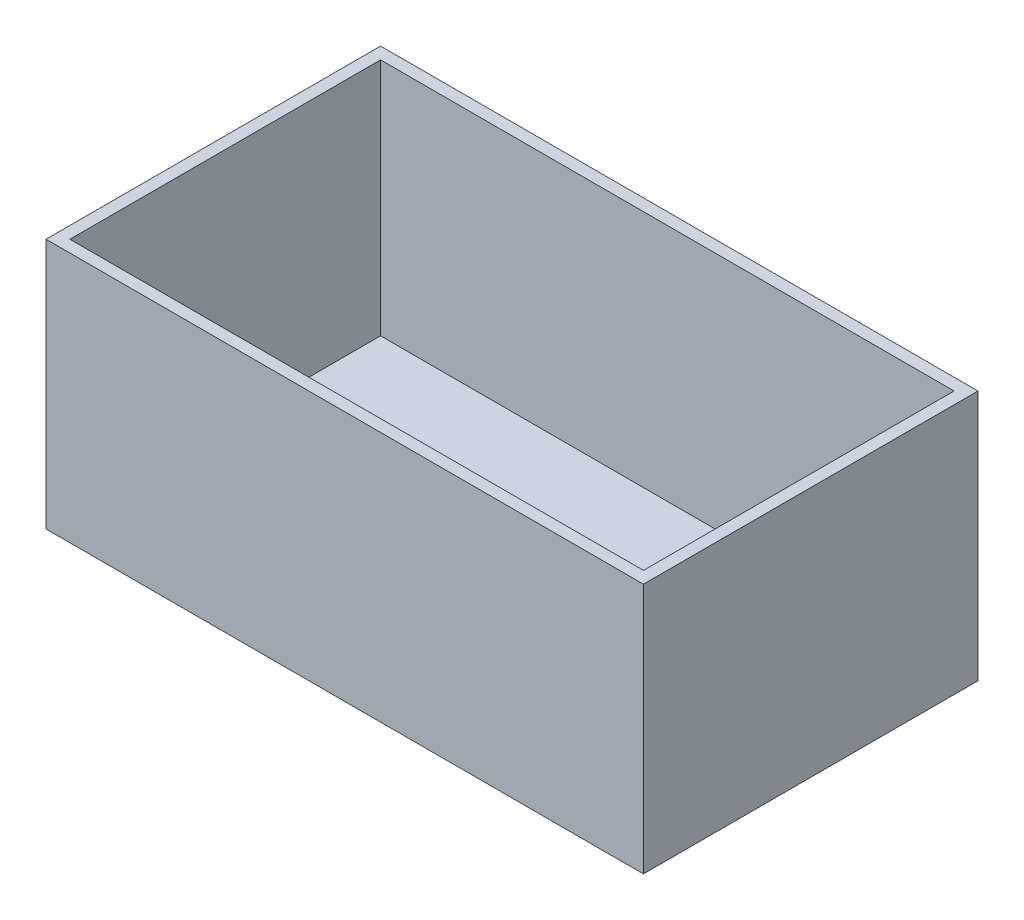
ISO-10303-21;
HEADER;
FILE_DESCRIPTION(('STEP AP214'),'2;1');
FILE_NAME('part.step','',(''),(''),'','','');
FILE_SCHEMA(('AUTOMOTIVE_DESIGN { 1 0 10303 214 1 1 1 1 }'));
ENDSEC;
DATA;
#1=APPLICATION_CONTEXT('core data for automotive mechanical design processes');
#2=APPLICATION_PROTOCOL_DEFINITION('international standard','automotive_design',2000,#1);
#3=PRODUCT_CONTEXT('',#1,'mechanical');
#4=PRODUCT('Part','Part','',(#3));
#5=PRODUCT_RELATED_PRODUCT_CATEGORY('part','',(#4));
#6=PRODUCT_DEFINITION_FORMATION('','',#4);
#7=PRODUCT_DEFINITION_CONTEXT('part definition',#1,'design');
#8=PRODUCT_DEFINITION('design','',#6,#7);
#9=PRODUCT_DEFINITION_SHAPE('','',#8);
#10=(LENGTH_UNIT() NAMED_UNIT(*) SI_UNIT(.MILLI.,.METRE.));
#11=(NAMED_UNIT(*) PLANE_ANGLE_UNIT() SI_UNIT($,.RADIAN.));
#12=(NAMED_UNIT(*) SI_UNIT($,.STERADIAN.) SOLID_ANGLE_UNIT());
#13=UNCERTAINTY_MEASURE_WITH_UNIT(LENGTH_MEASURE(1.E-05),#10,'distance_accuracy_value','');
#14=(GEOMETRIC_REPRESENTATION_CONTEXT(3) GLOBAL_UNCERTAINTY_ASSIGNED_CONTEXT((#13)) GLOBAL_UNIT_ASSIGNED_CONTEXT((#10,
#11,#12)) REPRESENTATION_CONTEXT('',''));
#15=CARTESIAN_POINT('',(0.,0.,0.));
#16=DIRECTION('',(0.,0.,1.));
#17=DIRECTION('',(1.,0.,0.));
#18=AXIS2_PLACEMENT_3D('',#15,#16,#17);
#19=CARTESIAN_POINT('',(-85.3448275862069,-63.,-44.7737068965517));
#20=DIRECTION('',(-1.,0.,0.));
#21=DIRECTION('',(0.,0.,1.));
#22=AXIS2_PLACEMENT_3D('',#19,#20,#21);
#23=PLANE('',#22);
#24=DIRECTION('',(0.,0.,1.));
#25=VECTOR('',#24,1.);
#26=CARTESIAN_POINT('',(-85.3448275862069,0.,-44.7737068965517));
#27=LINE('',#26,#25);
#28=CARTESIAN_POINT('',(-85.3448275862069,0.,-44.7737068965517));
#29=VERTEX_POINT('',#28);
#30=CARTESIAN_POINT('',(-85.3448275862069,0.,39.2262931034483));
#31=VERTEX_POINT('',#30);
#32=EDGE_CURVE('E120',#29,#31,#27,.T.);
#33=ORIENTED_EDGE('',*,*,#32,.F.);
#34=DIRECTION('',(0.,1.,0.));
#35=VECTOR('',#34,1.);
#36=CARTESIAN_POINT('',(-85.3448275862069,-63.,-44.7737068965517));
#37=LINE('',#36,#35);
#38=CARTESIAN_POINT('',(-85.3448275862069,-63.,-44.7737068965517));
#39=VERTEX_POINT('',#38);
#40=EDGE_CURVE('E11',#39,#29,#37,.T.);
#41=ORIENTED_EDGE('',*,*,#40,.F.);
#42=DIRECTION('',(0.,0.,1.));
#43=VECTOR('',#42,1.);
#44=CARTESIAN_POINT('',(-85.3448275862069,-63.,-44.7737068965517));
#45=LINE('',#44,#43);
#46=CARTESIAN_POINT('',(-85.3448275862069,-63.,39.2262931034483));
#47=VERTEX_POINT('',#46);
#48=EDGE_CURVE('E151',#39,#47,#45,.T.);
#49=ORIENTED_EDGE('',*,*,#48,.T.);
#50=DIRECTION('',(0.,1.,0.));
#51=VECTOR('',#50,1.);
#52=CARTESIAN_POINT('',(-85.3448275862069,-63.,39.2262931034483));
#53=LINE('',#52,#51);
#54=EDGE_CURVE('E41',#47,#31,#53,.T.);
#55=ORIENTED_EDGE('',*,*,#54,.T.);
#56=EDGE_LOOP('',(#33,#41,#49,#55));
#57=FACE_BOUND('',#56,.T.);
#58=ADVANCED_FACE('F38',(#57),#23,.T.);
#59=CARTESIAN_POINT('',(-85.3448275862069,-63.,-44.7737068965517));
#60=DIRECTION('',(0.,0.,-1.));
#61=DIRECTION('',(-1.,0.,0.));
#62=AXIS2_PLACEMENT_3D('',#59,#60,#61);
#63=PLANE('',#62);
#64=DIRECTION('',(-1.,0.,0.));
#65=VECTOR('',#64,1.);
#66=CARTESIAN_POINT('',(-85.3448275862069,0.,-44.7737068965517));
#67=LINE('',#66,#65);
#68=CARTESIAN_POINT('',(64.6551724137931,0.,-44.7737068965517));
#69=VERTEX_POINT('',#68);
#70=EDGE_CURVE('E154',#69,#29,#67,.T.);
#71=ORIENTED_EDGE('',*,*,#70,.F.);
#72=DIRECTION('',(0.,1.,0.));
#73=VECTOR('',#72,1.);
#74=CARTESIAN_POINT('',(64.6551724137931,-63.,-44.7737068965517));
#75=LINE('',#74,#73);
#76=CARTESIAN_POINT('',(64.6551724137931,-63.,-44.7737068965517));
#77=VERTEX_POINT('',#76);
#78=EDGE_CURVE('E46',#77,#69,#75,.T.);
#79=ORIENTED_EDGE('',*,*,#78,.F.);
#80=DIRECTION('',(-1.,0.,0.));
#81=VECTOR('',#80,1.);
#82=CARTESIAN_POINT('',(-85.3448275862069,-63.,-44.7737068965517));
#83=LINE('',#82,#81);
#84=EDGE_CURVE('E159',#77,#39,#83,.T.);
#85=ORIENTED_EDGE('',*,*,#84,.T.);
#86=ORIENTED_EDGE('',*,*,#40,.T.);
#87=EDGE_LOOP('',(#71,#79,#85,#86));
#88=FACE_BOUND('',#87,.T.);
#89=ADVANCED_FACE('F176',(#88),#63,.T.);
#90=CARTESIAN_POINT('',(64.6551724137931,-63.,-44.7737068965517));
#91=DIRECTION('',(1.,0.,0.));
#92=DIRECTION('',(0.,0.,-1.));
#93=AXIS2_PLACEMENT_3D('',#90,#91,#92);
#94=PLANE('',#93);
#95=DIRECTION('',(0.,0.,-1.));
#96=VECTOR('',#95,1.);
#97=CARTESIAN_POINT('',(64.6551724137931,0.,-44.7737068965517));
#98=LINE('',#97,#96);
#99=CARTESIAN_POINT('',(64.6551724137931,0.,39.2262931034483));
#100=VERTEX_POINT('',#99);
#101=EDGE_CURVE('E166',#100,#69,#98,.T.);
#102=ORIENTED_EDGE('',*,*,#101,.F.);
#103=DIRECTION('',(0.,1.,0.));
#104=VECTOR('',#103,1.);
#105=CARTESIAN_POINT('',(64.6551724137931,-63.,39.2262931034483));
#106=LINE('',#105,#104);
#107=CARTESIAN_POINT('',(64.6551724137931,-63.,39.2262931034483));
#108=VERTEX_POINT('',#107);
#109=EDGE_CURVE('E171',#108,#100,#106,.T.);
#110=ORIENTED_EDGE('',*,*,#109,.F.);
#111=DIRECTION('',(0.,0.,-1.));
#112=VECTOR('',#111,1.);
#113=CARTESIAN_POINT('',(64.6551724137931,-63.,-44.7737068965517));
#114=LINE('',#113,#112);
#115=EDGE_CURVE('E156',#108,#77,#114,.T.);
#116=ORIENTED_EDGE('',*,*,#115,.T.);
#117=ORIENTED_EDGE('',*,*,#78,.T.);
#118=EDGE_LOOP('',(#102,#110,#116,#117));
#119=FACE_BOUND('',#118,.T.);
#120=ADVANCED_FACE('F180',(#119),#94,.T.);
#121=CARTESIAN_POINT('',(-85.3448275862069,-63.,39.2262931034483));
#122=DIRECTION('',(0.,0.,1.));
#123=DIRECTION('',(1.,0.,0.));
#124=AXIS2_PLACEMENT_3D('',#121,#122,#123);
#125=PLANE('',#124);
#126=DIRECTION('',(1.,0.,0.));
#127=VECTOR('',#126,1.);
#128=CARTESIAN_POINT('',(-85.3448275862069,0.,39.2262931034483));
#129=LINE('',#128,#127);
#130=EDGE_CURVE('E163',#31,#100,#129,.T.);
#131=ORIENTED_EDGE('',*,*,#130,.F.);
#132=ORIENTED_EDGE('',*,*,#54,.F.);
#133=DIRECTION('',(1.,0.,0.));
#134=VECTOR('',#133,1.);
#135=CARTESIAN_POINT('',(-85.3448275862069,-63.,39.2262931034483));
#136=LINE('',#135,#134);
#137=EDGE_CURVE('E153',#47,#108,#136,.T.);
#138=ORIENTED_EDGE('',*,*,#137,.T.);
#139=ORIENTED_EDGE('',*,*,#109,.T.);
#140=EDGE_LOOP('',(#131,#132,#138,#139));
#141=FACE_BOUND('',#140,.T.);
#142=ADVANCED_FACE('F173',(#141),#125,.T.);
#143=CARTESIAN_POINT('',(0.,-63.,0.));
#144=DIRECTION('',(0.,1.,0.));
#145=DIRECTION('',(0.,0.,1.));
#146=AXIS2_PLACEMENT_3D('',#143,#144,#145);
#147=PLANE('',#146);
#148=ORIENTED_EDGE('',*,*,#48,.F.);
#149=ORIENTED_EDGE('',*,*,#84,.F.);
#150=ORIENTED_EDGE('',*,*,#115,.F.);
#151=ORIENTED_EDGE('',*,*,#137,.F.);
#152=EDGE_LOOP('',(#148,#149,#150,#151));
#153=FACE_BOUND('',#152,.T.);
#154=ADVANCED_FACE('F182',(#153),#147,.F.);
#155=CARTESIAN_POINT('',(0.,0.,0.));
#156=DIRECTION('',(0.,1.,0.));
#157=DIRECTION('',(0.,0.,1.));
#158=AXIS2_PLACEMENT_3D('',#155,#156,#157);
#159=PLANE('',#158);
#160=DIRECTION('',(0.,0.,1.));
#161=VECTOR('',#160,1.);
#162=CARTESIAN_POINT('',(-82.3448275862069,0.,0.));
#163=LINE('',#162,#161);
#164=CARTESIAN_POINT('',(-82.3448275862069,0.,-41.7737068965517));
#165=VERTEX_POINT('',#164);
#166=CARTESIAN_POINT('',(-82.3448275862069,0.,36.2262931034483));
#167=VERTEX_POINT('',#166);
#168=EDGE_CURVE('E144',#165,#167,#163,.T.);
#169=ORIENTED_EDGE('',*,*,#168,.F.);
#170=DIRECTION('',(-1.,0.,0.));
#171=VECTOR('',#170,1.);
#172=CARTESIAN_POINT('',(0.,0.,-41.7737068965517));
#173=LINE('',#172,#171);
#174=CARTESIAN_POINT('',(61.6551724137931,0.,-41.7737068965517));
#175=VERTEX_POINT('',#174);
#176=EDGE_CURVE('E116',#175,#165,#173,.T.);
#177=ORIENTED_EDGE('',*,*,#176,.F.);
#178=DIRECTION('',(0.,0.,-1.));
#179=VECTOR('',#178,1.);
#180=CARTESIAN_POINT('',(61.6551724137931,0.,0.));
#181=LINE('',#180,#179);
#182=CARTESIAN_POINT('',(61.6551724137931,0.,36.2262931034483));
#183=VERTEX_POINT('',#182);
#184=EDGE_CURVE('E54',#183,#175,#181,.T.);
#185=ORIENTED_EDGE('',*,*,#184,.F.);
#186=DIRECTION('',(1.,0.,0.));
#187=VECTOR('',#186,1.);
#188=CARTESIAN_POINT('',(0.,0.,36.2262931034483));
#189=LINE('',#188,#187);
#190=EDGE_CURVE('E146',#167,#183,#189,.T.);
#191=ORIENTED_EDGE('',*,*,#190,.F.);
#192=EDGE_LOOP('',(#169,#177,#185,#191));
#193=FACE_BOUND('',#192,.T.);
#194=ORIENTED_EDGE('',*,*,#32,.T.);
#195=ORIENTED_EDGE('',*,*,#130,.T.);
#196=ORIENTED_EDGE('',*,*,#101,.T.);
#197=ORIENTED_EDGE('',*,*,#70,.T.);
#198=EDGE_LOOP('',(#194,#195,#196,#197));
#199=FACE_BOUND('',#198,.T.);
#200=ADVANCED_FACE('F175',(#193,#199),#159,.T.);
#201=CARTESIAN_POINT('',(-82.3448275862069,-63.,-44.7737068965517));
#202=DIRECTION('',(-1.,0.,0.));
#203=DIRECTION('',(0.,0.,1.));
#204=AXIS2_PLACEMENT_3D('',#201,#202,#203);
#205=PLANE('',#204);
#206=ORIENTED_EDGE('',*,*,#168,.T.);
#207=DIRECTION('',(0.,1.,0.));
#208=VECTOR('',#207,1.);
#209=CARTESIAN_POINT('',(-82.3448275862069,-63.,36.2262931034483));
#210=LINE('',#209,#208);
#211=CARTESIAN_POINT('',(-82.3448275862069,-60.,36.2262931034483));
#212=VERTEX_POINT('',#211);
#213=EDGE_CURVE('E126',#212,#167,#210,.T.);
#214=ORIENTED_EDGE('',*,*,#213,.F.);
#215=DIRECTION('',(0.,0.,1.));
#216=VECTOR('',#215,1.);
#217=CARTESIAN_POINT('',(-82.3448275862069,-60.,0.));
#218=LINE('',#217,#216);
#219=CARTESIAN_POINT('',(-82.3448275862069,-60.,-41.7737068965517));
#220=VERTEX_POINT('',#219);
#221=EDGE_CURVE('E124',#220,#212,#218,.T.);
#222=ORIENTED_EDGE('',*,*,#221,.F.);
#223=DIRECTION('',(0.,1.,0.));
#224=VECTOR('',#223,1.);
#225=CARTESIAN_POINT('',(-82.3448275862069,-63.,-41.7737068965517));
#226=LINE('',#225,#224);
#227=EDGE_CURVE('E110',#220,#165,#226,.T.);
#228=ORIENTED_EDGE('',*,*,#227,.T.);
#229=EDGE_LOOP('',(#206,#214,#222,#228));
#230=FACE_BOUND('',#229,.T.);
#231=ADVANCED_FACE('F125',(#230),#205,.F.);
#232=CARTESIAN_POINT('',(-85.3448275862069,-63.,-41.7737068965517));
#233=DIRECTION('',(0.,0.,-1.));
#234=DIRECTION('',(-1.,0.,0.));
#235=AXIS2_PLACEMENT_3D('',#232,#233,#234);
#236=PLANE('',#235);
#237=ORIENTED_EDGE('',*,*,#176,.T.);
#238=ORIENTED_EDGE('',*,*,#227,.F.);
#239=DIRECTION('',(-1.,0.,0.));
#240=VECTOR('',#239,1.);
#241=CARTESIAN_POINT('',(0.,-60.,-41.7737068965517));
#242=LINE('',#241,#240);
#243=CARTESIAN_POINT('',(61.6551724137931,-60.,-41.7737068965517));
#244=VERTEX_POINT('',#243);
#245=EDGE_CURVE('E114',#244,#220,#242,.T.);
#246=ORIENTED_EDGE('',*,*,#245,.F.);
#247=DIRECTION('',(0.,1.,0.));
#248=VECTOR('',#247,1.);
#249=CARTESIAN_POINT('',(61.6551724137931,-63.,-41.7737068965517));
#250=LINE('',#249,#248);
#251=EDGE_CURVE('E121',#244,#175,#250,.T.);
#252=ORIENTED_EDGE('',*,*,#251,.T.);
#253=EDGE_LOOP('',(#237,#238,#246,#252));
#254=FACE_BOUND('',#253,.T.);
#255=ADVANCED_FACE('F112',(#254),#236,.F.);
#256=CARTESIAN_POINT('',(61.6551724137931,-63.,-44.7737068965517));
#257=DIRECTION('',(1.,0.,0.));
#258=DIRECTION('',(0.,0.,-1.));
#259=AXIS2_PLACEMENT_3D('',#256,#257,#258);
#260=PLANE('',#259);
#261=ORIENTED_EDGE('',*,*,#184,.T.);
#262=ORIENTED_EDGE('',*,*,#251,.F.);
#263=DIRECTION('',(0.,0.,-1.));
#264=VECTOR('',#263,1.);
#265=CARTESIAN_POINT('',(61.6551724137931,-60.,0.));
#266=LINE('',#265,#264);
#267=CARTESIAN_POINT('',(61.6551724137931,-60.,36.2262931034483));
#268=VERTEX_POINT('',#267);
#269=EDGE_CURVE('E135',#268,#244,#266,.T.);
#270=ORIENTED_EDGE('',*,*,#269,.F.);
#271=DIRECTION('',(0.,1.,0.));
#272=VECTOR('',#271,1.);
#273=CARTESIAN_POINT('',(61.6551724137931,-63.,36.2262931034483));
#274=LINE('',#273,#272);
#275=EDGE_CURVE('E137',#268,#183,#274,.T.);
#276=ORIENTED_EDGE('',*,*,#275,.T.);
#277=EDGE_LOOP('',(#261,#262,#270,#276));
#278=FACE_BOUND('',#277,.T.);
#279=ADVANCED_FACE('F234',(#278),#260,.F.);
#280=CARTESIAN_POINT('',(-85.3448275862069,-63.,36.2262931034483));
#281=DIRECTION('',(0.,0.,1.));
#282=DIRECTION('',(1.,0.,0.));
#283=AXIS2_PLACEMENT_3D('',#280,#281,#282);
#284=PLANE('',#283);
#285=ORIENTED_EDGE('',*,*,#190,.T.);
#286=ORIENTED_EDGE('',*,*,#275,.F.);
#287=DIRECTION('',(1.,0.,0.));
#288=VECTOR('',#287,1.);
#289=CARTESIAN_POINT('',(0.,-60.,36.2262931034483));
#290=LINE('',#289,#288);
#291=EDGE_CURVE('E130',#212,#268,#290,.T.);
#292=ORIENTED_EDGE('',*,*,#291,.F.);
#293=ORIENTED_EDGE('',*,*,#213,.T.);
#294=EDGE_LOOP('',(#285,#286,#292,#293));
#295=FACE_BOUND('',#294,.T.);
#296=ADVANCED_FACE('F243',(#295),#284,.F.);
#297=CARTESIAN_POINT('',(0.,-60.,0.));
#298=DIRECTION('',(0.,1.,0.));
#299=DIRECTION('',(0.,0.,1.));
#300=AXIS2_PLACEMENT_3D('',#297,#298,#299);
#301=PLANE('',#300);
#302=ORIENTED_EDGE('',*,*,#221,.T.);
#303=ORIENTED_EDGE('',*,*,#291,.T.);
#304=ORIENTED_EDGE('',*,*,#269,.T.);
#305=ORIENTED_EDGE('',*,*,#245,.T.);
#306=EDGE_LOOP('',(#302,#303,#304,#305));
#307=FACE_BOUND('',#306,.T.);
#308=ADVANCED_FACE('F133',(#307),#301,.T.);
#309=CLOSED_SHELL('',(#58,#89,#120,#142,#154,#200,#231,#255,#279,#296,#308));
#310=MANIFOLD_SOLID_BREP('B2',#309);
#311=ADVANCED_BREP_SHAPE_REPRESENTATION('',(#18,#310),#14);
#312=SHAPE_DEFINITION_REPRESENTATION(#9,#311);
ENDSEC;
END-ISO-10303-21;
